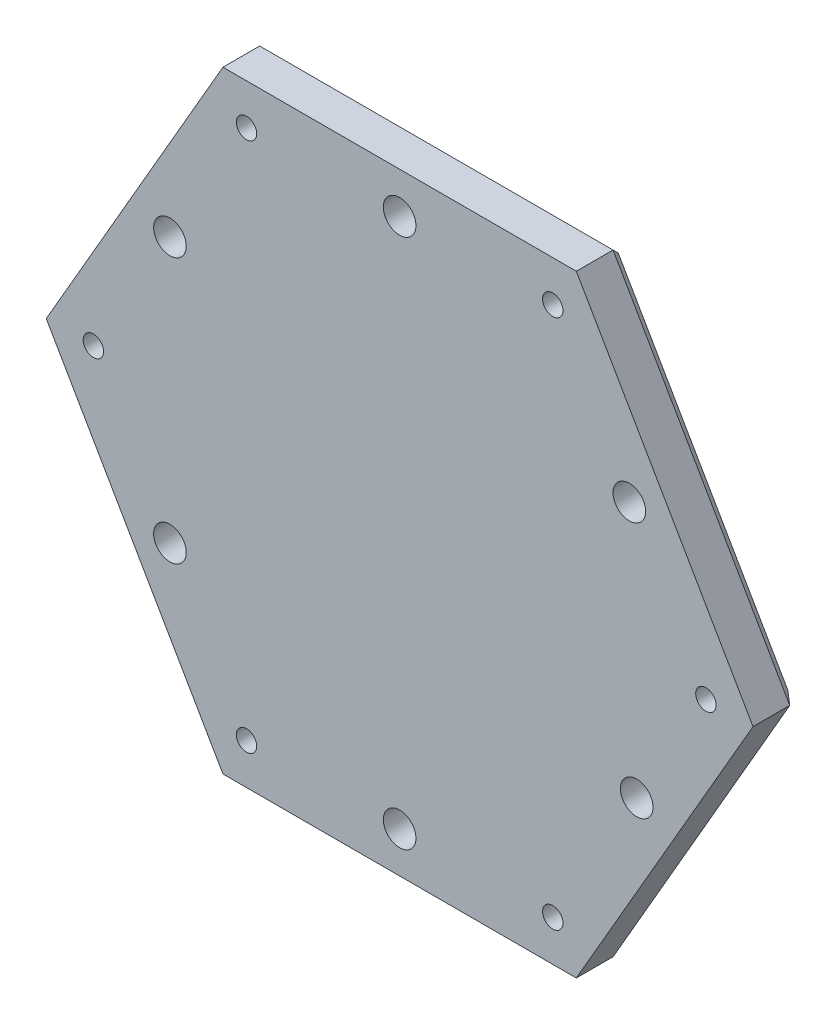
ISO-10303-21;
HEADER;
FILE_DESCRIPTION(('STEP AP214'),'2;1');
FILE_NAME('part.step','',(''),(''),'','','');
FILE_SCHEMA(('AUTOMOTIVE_DESIGN { 1 0 10303 214 1 1 1 1 }'));
ENDSEC;
DATA;
#1=APPLICATION_CONTEXT('core data for automotive mechanical design processes');
#2=APPLICATION_PROTOCOL_DEFINITION('international standard','automotive_design',2000,#1);
#3=PRODUCT_CONTEXT('',#1,'mechanical');
#4=PRODUCT('Part','Part','',(#3));
#5=PRODUCT_RELATED_PRODUCT_CATEGORY('part','',(#4));
#6=PRODUCT_DEFINITION_FORMATION('','',#4);
#7=PRODUCT_DEFINITION_CONTEXT('part definition',#1,'design');
#8=PRODUCT_DEFINITION('design','',#6,#7);
#9=PRODUCT_DEFINITION_SHAPE('','',#8);
#10=(LENGTH_UNIT() NAMED_UNIT(*) SI_UNIT(.MILLI.,.METRE.));
#11=(NAMED_UNIT(*) PLANE_ANGLE_UNIT() SI_UNIT($,.RADIAN.));
#12=(NAMED_UNIT(*) SI_UNIT($,.STERADIAN.) SOLID_ANGLE_UNIT());
#13=UNCERTAINTY_MEASURE_WITH_UNIT(LENGTH_MEASURE(1.E-05),#10,'distance_accuracy_value','');
#14=(GEOMETRIC_REPRESENTATION_CONTEXT(3) GLOBAL_UNCERTAINTY_ASSIGNED_CONTEXT((#13)) GLOBAL_UNIT_ASSIGNED_CONTEXT((#10,
#11,#12)) REPRESENTATION_CONTEXT('',''));
#15=CARTESIAN_POINT('',(0.,0.,0.));
#16=DIRECTION('',(0.,0.,1.));
#17=DIRECTION('',(1.,0.,0.));
#18=AXIS2_PLACEMENT_3D('',#15,#16,#17);
#19=CARTESIAN_POINT('',(43.3012701892223,-75.0000000000007,6.));
#20=DIRECTION('',(-0.866025403784439,0.5,0.));
#21=DIRECTION('',(-0.5,-0.866025403784439,0.));
#22=AXIS2_PLACEMENT_3D('',#19,#20,#21);
#23=PLANE('',#22);
#24=DIRECTION('',(0.,0.,-1.));
#25=VECTOR('',#24,1.);
#26=CARTESIAN_POINT('',(43.3012701892223,-75.0000000000007,6.));
#27=LINE('',#26,#25);
#28=CARTESIAN_POINT('',(43.3012701892223,-75.0000000000007,6.));
#29=VERTEX_POINT('',#28);
#30=CARTESIAN_POINT('',(43.3012701892223,-75.0000000000007,-2.99999999999997));
#31=VERTEX_POINT('',#30);
#32=EDGE_CURVE('E215',#29,#31,#27,.T.);
#33=ORIENTED_EDGE('',*,*,#32,.T.);
#34=DIRECTION('',(0.5,0.866025403784439,0.));
#35=VECTOR('',#34,1.);
#36=CARTESIAN_POINT('',(43.3012701892223,-75.0000000000007,-2.99999999999997));
#37=LINE('',#36,#35);
#38=CARTESIAN_POINT('',(86.6025403784446,0.,-2.99999999999997));
#39=VERTEX_POINT('',#38);
#40=EDGE_CURVE('E11',#31,#39,#37,.T.);
#41=ORIENTED_EDGE('',*,*,#40,.T.);
#42=DIRECTION('',(0.,0.,-1.));
#43=VECTOR('',#42,1.);
#44=CARTESIAN_POINT('',(86.6025403784446,0.,6.));
#45=LINE('',#44,#43);
#46=CARTESIAN_POINT('',(86.6025403784446,0.,6.));
#47=VERTEX_POINT('',#46);
#48=EDGE_CURVE('E125',#47,#39,#45,.T.);
#49=ORIENTED_EDGE('',*,*,#48,.F.);
#50=DIRECTION('',(0.5,0.866025403784438,0.));
#51=VECTOR('',#50,1.);
#52=CARTESIAN_POINT('',(43.3012701892223,-75.0000000000007,6.));
#53=LINE('',#52,#51);
#54=EDGE_CURVE('E132',#29,#47,#53,.T.);
#55=ORIENTED_EDGE('',*,*,#54,.F.);
#56=EDGE_LOOP('',(#33,#41,#49,#55));
#57=FACE_BOUND('',#56,.T.);
#58=ADVANCED_FACE('F45',(#57),#23,.F.);
#59=CARTESIAN_POINT('',(86.6025403784446,0.,6.));
#60=DIRECTION('',(-0.866025403784439,-0.5,0.));
#61=DIRECTION('',(0.5,-0.866025403784439,0.));
#62=AXIS2_PLACEMENT_3D('',#59,#60,#61);
#63=PLANE('',#62);
#64=ORIENTED_EDGE('',*,*,#48,.T.);
#65=DIRECTION('',(-0.5,0.866025403784439,0.));
#66=VECTOR('',#65,1.);
#67=CARTESIAN_POINT('',(86.6025403784446,0.,-2.99999999999997));
#68=LINE('',#67,#66);
#69=CARTESIAN_POINT('',(43.3012701892223,75.0000000000007,-2.99999999999997));
#70=VERTEX_POINT('',#69);
#71=EDGE_CURVE('E141',#39,#70,#68,.T.);
#72=ORIENTED_EDGE('',*,*,#71,.T.);
#73=DIRECTION('',(0.,0.,-1.));
#74=VECTOR('',#73,1.);
#75=CARTESIAN_POINT('',(43.3012701892223,75.0000000000007,6.));
#76=LINE('',#75,#74);
#77=CARTESIAN_POINT('',(43.3012701892223,75.0000000000007,6.));
#78=VERTEX_POINT('',#77);
#79=EDGE_CURVE('E128',#78,#70,#76,.T.);
#80=ORIENTED_EDGE('',*,*,#79,.F.);
#81=DIRECTION('',(-0.5,0.866025403784439,0.));
#82=VECTOR('',#81,1.);
#83=CARTESIAN_POINT('',(86.6025403784446,0.,6.));
#84=LINE('',#83,#82);
#85=EDGE_CURVE('E120',#47,#78,#84,.T.);
#86=ORIENTED_EDGE('',*,*,#85,.F.);
#87=EDGE_LOOP('',(#64,#72,#80,#86));
#88=FACE_BOUND('',#87,.T.);
#89=ADVANCED_FACE('F122',(#88),#63,.F.);
#90=CARTESIAN_POINT('',(43.3012701892223,75.0000000000007,6.));
#91=DIRECTION('',(0.,-1.,0.));
#92=DIRECTION('',(0.,0.,-1.));
#93=AXIS2_PLACEMENT_3D('',#90,#91,#92);
#94=PLANE('',#93);
#95=ORIENTED_EDGE('',*,*,#79,.T.);
#96=DIRECTION('',(-1.,0.,0.));
#97=VECTOR('',#96,1.);
#98=CARTESIAN_POINT('',(43.3012701892223,75.0000000000007,-2.99999999999997));
#99=LINE('',#98,#97);
#100=CARTESIAN_POINT('',(-43.3012701892223,75.0000000000007,-2.99999999999998));
#101=VERTEX_POINT('',#100);
#102=EDGE_CURVE('E161',#70,#101,#99,.T.);
#103=ORIENTED_EDGE('',*,*,#102,.T.);
#104=DIRECTION('',(0.,0.,-1.));
#105=VECTOR('',#104,1.);
#106=CARTESIAN_POINT('',(-43.3012701892223,75.0000000000007,6.));
#107=LINE('',#106,#105);
#108=CARTESIAN_POINT('',(-43.3012701892223,75.0000000000007,6.));
#109=VERTEX_POINT('',#108);
#110=EDGE_CURVE('E145',#109,#101,#107,.T.);
#111=ORIENTED_EDGE('',*,*,#110,.F.);
#112=DIRECTION('',(-1.,0.,0.));
#113=VECTOR('',#112,1.);
#114=CARTESIAN_POINT('',(43.3012701892223,75.0000000000007,6.));
#115=LINE('',#114,#113);
#116=EDGE_CURVE('E131',#78,#109,#115,.T.);
#117=ORIENTED_EDGE('',*,*,#116,.F.);
#118=EDGE_LOOP('',(#95,#103,#111,#117));
#119=FACE_BOUND('',#118,.T.);
#120=ADVANCED_FACE('F204',(#119),#94,.F.);
#121=CARTESIAN_POINT('',(-43.3012701892223,75.0000000000007,6.));
#122=DIRECTION('',(0.866025403784439,-0.5,0.));
#123=DIRECTION('',(0.5,0.866025403784439,0.));
#124=AXIS2_PLACEMENT_3D('',#121,#122,#123);
#125=PLANE('',#124);
#126=ORIENTED_EDGE('',*,*,#110,.T.);
#127=DIRECTION('',(-0.5,-0.866025403784439,0.));
#128=VECTOR('',#127,1.);
#129=CARTESIAN_POINT('',(-43.3012701892223,75.0000000000007,-2.99999999999998));
#130=LINE('',#129,#128);
#131=CARTESIAN_POINT('',(-86.6025403784446,0.,-2.99999999999997));
#132=VERTEX_POINT('',#131);
#133=EDGE_CURVE('E163',#101,#132,#130,.T.);
#134=ORIENTED_EDGE('',*,*,#133,.T.);
#135=DIRECTION('',(0.,0.,-1.));
#136=VECTOR('',#135,1.);
#137=CARTESIAN_POINT('',(-86.6025403784446,0.,6.));
#138=LINE('',#137,#136);
#139=CARTESIAN_POINT('',(-86.6025403784446,0.,6.));
#140=VERTEX_POINT('',#139);
#141=EDGE_CURVE('E219',#140,#132,#138,.T.);
#142=ORIENTED_EDGE('',*,*,#141,.F.);
#143=DIRECTION('',(-0.5,-0.866025403784439,0.));
#144=VECTOR('',#143,1.);
#145=CARTESIAN_POINT('',(-43.3012701892223,75.0000000000007,6.));
#146=LINE('',#145,#144);
#147=EDGE_CURVE('E208',#109,#140,#146,.T.);
#148=ORIENTED_EDGE('',*,*,#147,.F.);
#149=EDGE_LOOP('',(#126,#134,#142,#148));
#150=FACE_BOUND('',#149,.T.);
#151=ADVANCED_FACE('F221',(#150),#125,.F.);
#152=CARTESIAN_POINT('',(-86.6025403784446,0.,6.));
#153=DIRECTION('',(0.866025403784439,0.5,0.));
#154=DIRECTION('',(-0.5,0.866025403784439,0.));
#155=AXIS2_PLACEMENT_3D('',#152,#153,#154);
#156=PLANE('',#155);
#157=ORIENTED_EDGE('',*,*,#141,.T.);
#158=DIRECTION('',(0.5,-0.866025403784439,0.));
#159=VECTOR('',#158,1.);
#160=CARTESIAN_POINT('',(-86.6025403784446,0.,-2.99999999999997));
#161=LINE('',#160,#159);
#162=CARTESIAN_POINT('',(-43.3012701892223,-75.0000000000007,-2.99999999999997));
#163=VERTEX_POINT('',#162);
#164=EDGE_CURVE('E70',#132,#163,#161,.T.);
#165=ORIENTED_EDGE('',*,*,#164,.T.);
#166=DIRECTION('',(0.,0.,-1.));
#167=VECTOR('',#166,1.);
#168=CARTESIAN_POINT('',(-43.3012701892223,-75.0000000000007,6.));
#169=LINE('',#168,#167);
#170=CARTESIAN_POINT('',(-43.3012701892223,-75.0000000000007,6.));
#171=VERTEX_POINT('',#170);
#172=EDGE_CURVE('E217',#171,#163,#169,.T.);
#173=ORIENTED_EDGE('',*,*,#172,.F.);
#174=DIRECTION('',(0.5,-0.866025403784438,0.));
#175=VECTOR('',#174,1.);
#176=CARTESIAN_POINT('',(-86.6025403784446,0.,6.));
#177=LINE('',#176,#175);
#178=EDGE_CURVE('E210',#140,#171,#177,.T.);
#179=ORIENTED_EDGE('',*,*,#178,.F.);
#180=EDGE_LOOP('',(#157,#165,#173,#179));
#181=FACE_BOUND('',#180,.T.);
#182=ADVANCED_FACE('F284',(#181),#156,.F.);
#183=CARTESIAN_POINT('',(-43.3012701892223,-75.0000000000007,6.));
#184=DIRECTION('',(0.,1.,0.));
#185=DIRECTION('',(0.,0.,1.));
#186=AXIS2_PLACEMENT_3D('',#183,#184,#185);
#187=PLANE('',#186);
#188=ORIENTED_EDGE('',*,*,#172,.T.);
#189=DIRECTION('',(1.,0.,0.));
#190=VECTOR('',#189,1.);
#191=CARTESIAN_POINT('',(-43.3012701892223,-75.0000000000007,-2.99999999999997));
#192=LINE('',#191,#190);
#193=EDGE_CURVE('E55',#163,#31,#192,.T.);
#194=ORIENTED_EDGE('',*,*,#193,.T.);
#195=ORIENTED_EDGE('',*,*,#32,.F.);
#196=DIRECTION('',(1.,0.,0.));
#197=VECTOR('',#196,1.);
#198=CARTESIAN_POINT('',(-43.3012701892223,-75.0000000000007,6.));
#199=LINE('',#198,#197);
#200=EDGE_CURVE('E137',#171,#29,#199,.T.);
#201=ORIENTED_EDGE('',*,*,#200,.F.);
#202=EDGE_LOOP('',(#188,#194,#195,#201));
#203=FACE_BOUND('',#202,.T.);
#204=ADVANCED_FACE('F276',(#203),#187,.F.);
#205=CARTESIAN_POINT('',(0.,0.,6.));
#206=DIRECTION('',(0.,0.,1.));
#207=DIRECTION('',(1.,0.,0.));
#208=AXIS2_PLACEMENT_3D('',#205,#206,#207);
#209=PLANE('',#208);
#210=CARTESIAN_POINT('',(-56.2916512459885,32.5,6.));
#211=DIRECTION('',(0.,0.,1.));
#212=DIRECTION('',(1.,0.,0.));
#213=AXIS2_PLACEMENT_3D('',#210,#211,#212);
#214=CIRCLE('',#213,3.99999999999999);
#215=CARTESIAN_POINT('',(-52.2916512459885,32.5,6.));
#216=VERTEX_POINT('',#215);
#217=EDGE_CURVE('E490',#216,#216,#214,.T.);
#218=ORIENTED_EDGE('',*,*,#217,.F.);
#219=EDGE_LOOP('',(#218));
#220=FACE_BOUND('',#219,.T.);
#221=CARTESIAN_POINT('',(0.,65.,6.));
#222=DIRECTION('',(0.,0.,1.));
#223=DIRECTION('',(1.,0.,0.));
#224=AXIS2_PLACEMENT_3D('',#221,#222,#223);
#225=CIRCLE('',#224,3.99999999999999);
#226=CARTESIAN_POINT('',(3.99999999999995,65.,6.));
#227=VERTEX_POINT('',#226);
#228=EDGE_CURVE('E492',#227,#227,#225,.T.);
#229=ORIENTED_EDGE('',*,*,#228,.F.);
#230=EDGE_LOOP('',(#229));
#231=FACE_BOUND('',#230,.T.);
#232=CARTESIAN_POINT('',(56.2916512459885,32.5,6.));
#233=DIRECTION('',(0.,0.,1.));
#234=DIRECTION('',(1.,0.,0.));
#235=AXIS2_PLACEMENT_3D('',#232,#233,#234);
#236=CIRCLE('',#235,3.99999999999999);
#237=CARTESIAN_POINT('',(60.2916512459885,32.5,6.));
#238=VERTEX_POINT('',#237);
#239=EDGE_CURVE('E500',#238,#238,#236,.T.);
#240=ORIENTED_EDGE('',*,*,#239,.F.);
#241=EDGE_LOOP('',(#240));
#242=FACE_BOUND('',#241,.T.);
#243=CARTESIAN_POINT('',(58.0963351892695,-29.3741957186336,6.));
#244=DIRECTION('',(0.,0.,1.));
#245=DIRECTION('',(1.,0.,0.));
#246=AXIS2_PLACEMENT_3D('',#243,#244,#245);
#247=CIRCLE('',#246,3.99999999999999);
#248=CARTESIAN_POINT('',(62.0963351892694,-29.3741957186336,6.));
#249=VERTEX_POINT('',#248);
#250=EDGE_CURVE('E506',#249,#249,#247,.T.);
#251=ORIENTED_EDGE('',*,*,#250,.F.);
#252=EDGE_LOOP('',(#251));
#253=FACE_BOUND('',#252,.T.);
#254=CARTESIAN_POINT('',(0.,-65.,6.));
#255=DIRECTION('',(0.,0.,1.));
#256=DIRECTION('',(1.,0.,0.));
#257=AXIS2_PLACEMENT_3D('',#254,#255,#256);
#258=CIRCLE('',#257,3.99999999999999);
#259=CARTESIAN_POINT('',(3.99999999999997,-65.,6.));
#260=VERTEX_POINT('',#259);
#261=EDGE_CURVE('E512',#260,#260,#258,.T.);
#262=ORIENTED_EDGE('',*,*,#261,.F.);
#263=EDGE_LOOP('',(#262));
#264=FACE_BOUND('',#263,.T.);
#265=CARTESIAN_POINT('',(-56.2916512459885,-32.5,6.));
#266=DIRECTION('',(0.,0.,1.));
#267=DIRECTION('',(1.,0.,0.));
#268=AXIS2_PLACEMENT_3D('',#265,#266,#267);
#269=CIRCLE('',#268,3.99999999999999);
#270=CARTESIAN_POINT('',(-52.2916512459885,-32.5,6.));
#271=VERTEX_POINT('',#270);
#272=EDGE_CURVE('E518',#271,#271,#269,.T.);
#273=ORIENTED_EDGE('',*,*,#272,.F.);
#274=EDGE_LOOP('',(#273));
#275=FACE_BOUND('',#274,.T.);
#276=CARTESIAN_POINT('',(-37.5277674973257,65.,6.));
#277=DIRECTION('',(0.,0.,1.));
#278=DIRECTION('',(1.,0.,0.));
#279=AXIS2_PLACEMENT_3D('',#276,#277,#278);
#280=CIRCLE('',#279,2.5);
#281=CARTESIAN_POINT('',(-35.0277674973257,65.,6.));
#282=VERTEX_POINT('',#281);
#283=EDGE_CURVE('E524',#282,#282,#280,.T.);
#284=ORIENTED_EDGE('',*,*,#283,.F.);
#285=EDGE_LOOP('',(#284));
#286=FACE_BOUND('',#285,.T.);
#287=CARTESIAN_POINT('',(37.5277674973256,65.,6.));
#288=DIRECTION('',(0.,0.,1.));
#289=DIRECTION('',(1.,0.,0.));
#290=AXIS2_PLACEMENT_3D('',#287,#288,#289);
#291=CIRCLE('',#290,2.5);
#292=CARTESIAN_POINT('',(40.0277674973256,65.,6.));
#293=VERTEX_POINT('',#292);
#294=EDGE_CURVE('E530',#293,#293,#291,.T.);
#295=ORIENTED_EDGE('',*,*,#294,.F.);
#296=EDGE_LOOP('',(#295));
#297=FACE_BOUND('',#296,.T.);
#298=CARTESIAN_POINT('',(75.0555349946513,0.,6.));
#299=DIRECTION('',(0.,0.,1.));
#300=DIRECTION('',(1.,0.,0.));
#301=AXIS2_PLACEMENT_3D('',#298,#299,#300);
#302=CIRCLE('',#301,2.49999999999999);
#303=CARTESIAN_POINT('',(77.5555349946513,0.,6.));
#304=VERTEX_POINT('',#303);
#305=EDGE_CURVE('E536',#304,#304,#302,.T.);
#306=ORIENTED_EDGE('',*,*,#305,.F.);
#307=EDGE_LOOP('',(#306));
#308=FACE_BOUND('',#307,.T.);
#309=CARTESIAN_POINT('',(37.5277674973257,-65.,6.));
#310=DIRECTION('',(0.,0.,1.));
#311=DIRECTION('',(1.,0.,0.));
#312=AXIS2_PLACEMENT_3D('',#309,#310,#311);
#313=CIRCLE('',#312,2.5);
#314=CARTESIAN_POINT('',(40.0277674973257,-65.,6.));
#315=VERTEX_POINT('',#314);
#316=EDGE_CURVE('E542',#315,#315,#313,.T.);
#317=ORIENTED_EDGE('',*,*,#316,.F.);
#318=EDGE_LOOP('',(#317));
#319=FACE_BOUND('',#318,.T.);
#320=CARTESIAN_POINT('',(-37.5277674973257,-65.,6.));
#321=DIRECTION('',(0.,0.,1.));
#322=DIRECTION('',(1.,0.,0.));
#323=AXIS2_PLACEMENT_3D('',#320,#321,#322);
#324=CIRCLE('',#323,2.5);
#325=CARTESIAN_POINT('',(-35.0277674973257,-65.,6.));
#326=VERTEX_POINT('',#325);
#327=EDGE_CURVE('E548',#326,#326,#324,.T.);
#328=ORIENTED_EDGE('',*,*,#327,.F.);
#329=EDGE_LOOP('',(#328));
#330=FACE_BOUND('',#329,.T.);
#331=CARTESIAN_POINT('',(-75.0555349946514,0.,6.));
#332=DIRECTION('',(0.,0.,1.));
#333=DIRECTION('',(1.,0.,0.));
#334=AXIS2_PLACEMENT_3D('',#331,#332,#333);
#335=CIRCLE('',#334,2.49999999999999);
#336=CARTESIAN_POINT('',(-72.5555349946514,0.,6.));
#337=VERTEX_POINT('',#336);
#338=EDGE_CURVE('E554',#337,#337,#335,.T.);
#339=ORIENTED_EDGE('',*,*,#338,.F.);
#340=EDGE_LOOP('',(#339));
#341=FACE_BOUND('',#340,.T.);
#342=ORIENTED_EDGE('',*,*,#54,.T.);
#343=ORIENTED_EDGE('',*,*,#85,.T.);
#344=ORIENTED_EDGE('',*,*,#116,.T.);
#345=ORIENTED_EDGE('',*,*,#147,.T.);
#346=ORIENTED_EDGE('',*,*,#178,.T.);
#347=ORIENTED_EDGE('',*,*,#200,.T.);
#348=EDGE_LOOP('',(#342,#343,#344,#345,#346,#347));
#349=FACE_BOUND('',#348,.T.);
#350=ADVANCED_FACE('F135',(#220,#231,#242,#253,#264,#275,#286,#297,#308,#319,#330,#341,#349),
#209,.T.);
#351=CARTESIAN_POINT('',(0.,0.,-6.));
#352=DIRECTION('',(0.,0.,1.));
#353=DIRECTION('',(1.,0.,0.));
#354=AXIS2_PLACEMENT_3D('',#351,#352,#353);
#355=PLANE('',#354);
#356=CARTESIAN_POINT('',(-56.2916512459885,32.5,-6.));
#357=DIRECTION('',(0.,0.,1.));
#358=DIRECTION('',(1.,0.,0.));
#359=AXIS2_PLACEMENT_3D('',#356,#357,#358);
#360=CIRCLE('',#359,3.99999999999999);
#361=CARTESIAN_POINT('',(-52.2916512459885,32.5,-6.));
#362=VERTEX_POINT('',#361);
#363=EDGE_CURVE('E487',#362,#362,#360,.T.);
#364=ORIENTED_EDGE('',*,*,#363,.T.);
#365=EDGE_LOOP('',(#364));
#366=FACE_BOUND('',#365,.T.);
#367=CARTESIAN_POINT('',(0.,65.,-6.));
#368=DIRECTION('',(0.,0.,1.));
#369=DIRECTION('',(1.,0.,0.));
#370=AXIS2_PLACEMENT_3D('',#367,#368,#369);
#371=CIRCLE('',#370,3.99999999999999);
#372=CARTESIAN_POINT('',(3.99999999999996,65.,-6.));
#373=VERTEX_POINT('',#372);
#374=EDGE_CURVE('E497',#373,#373,#371,.T.);
#375=ORIENTED_EDGE('',*,*,#374,.T.);
#376=EDGE_LOOP('',(#375));
#377=FACE_BOUND('',#376,.T.);
#378=CARTESIAN_POINT('',(56.2916512459885,32.5,-6.));
#379=DIRECTION('',(0.,0.,1.));
#380=DIRECTION('',(1.,0.,0.));
#381=AXIS2_PLACEMENT_3D('',#378,#379,#380);
#382=CIRCLE('',#381,3.99999999999999);
#383=CARTESIAN_POINT('',(60.2916512459885,32.5,-6.));
#384=VERTEX_POINT('',#383);
#385=EDGE_CURVE('E503',#384,#384,#382,.T.);
#386=ORIENTED_EDGE('',*,*,#385,.T.);
#387=EDGE_LOOP('',(#386));
#388=FACE_BOUND('',#387,.T.);
#389=CARTESIAN_POINT('',(58.0963351892695,-29.3741957186336,-6.));
#390=DIRECTION('',(0.,0.,1.));
#391=DIRECTION('',(1.,0.,0.));
#392=AXIS2_PLACEMENT_3D('',#389,#390,#391);
#393=CIRCLE('',#392,3.99999999999999);
#394=CARTESIAN_POINT('',(62.0963351892694,-29.3741957186336,-6.));
#395=VERTEX_POINT('',#394);
#396=EDGE_CURVE('E509',#395,#395,#393,.T.);
#397=ORIENTED_EDGE('',*,*,#396,.T.);
#398=EDGE_LOOP('',(#397));
#399=FACE_BOUND('',#398,.T.);
#400=CARTESIAN_POINT('',(0.,-65.,-6.));
#401=DIRECTION('',(0.,0.,1.));
#402=DIRECTION('',(1.,0.,0.));
#403=AXIS2_PLACEMENT_3D('',#400,#401,#402);
#404=CIRCLE('',#403,3.99999999999999);
#405=CARTESIAN_POINT('',(3.99999999999997,-65.,-6.));
#406=VERTEX_POINT('',#405);
#407=EDGE_CURVE('E515',#406,#406,#404,.T.);
#408=ORIENTED_EDGE('',*,*,#407,.T.);
#409=EDGE_LOOP('',(#408));
#410=FACE_BOUND('',#409,.T.);
#411=CARTESIAN_POINT('',(-56.2916512459885,-32.5,-6.));
#412=DIRECTION('',(0.,0.,1.));
#413=DIRECTION('',(1.,0.,0.));
#414=AXIS2_PLACEMENT_3D('',#411,#412,#413);
#415=CIRCLE('',#414,3.99999999999999);
#416=CARTESIAN_POINT('',(-52.2916512459885,-32.5,-6.));
#417=VERTEX_POINT('',#416);
#418=EDGE_CURVE('E521',#417,#417,#415,.T.);
#419=ORIENTED_EDGE('',*,*,#418,.T.);
#420=EDGE_LOOP('',(#419));
#421=FACE_BOUND('',#420,.T.);
#422=CARTESIAN_POINT('',(-37.5277674973257,65.,-6.));
#423=DIRECTION('',(0.,0.,1.));
#424=DIRECTION('',(1.,0.,0.));
#425=AXIS2_PLACEMENT_3D('',#422,#423,#424);
#426=CIRCLE('',#425,2.49999999999999);
#427=CARTESIAN_POINT('',(-35.0277674973257,65.,-6.));
#428=VERTEX_POINT('',#427);
#429=EDGE_CURVE('E527',#428,#428,#426,.T.);
#430=ORIENTED_EDGE('',*,*,#429,.T.);
#431=EDGE_LOOP('',(#430));
#432=FACE_BOUND('',#431,.T.);
#433=CARTESIAN_POINT('',(37.5277674973256,65.,-6.));
#434=DIRECTION('',(0.,0.,1.));
#435=DIRECTION('',(1.,0.,0.));
#436=AXIS2_PLACEMENT_3D('',#433,#434,#435);
#437=CIRCLE('',#436,2.49999999999999);
#438=CARTESIAN_POINT('',(40.0277674973256,65.,-6.));
#439=VERTEX_POINT('',#438);
#440=EDGE_CURVE('E533',#439,#439,#437,.T.);
#441=ORIENTED_EDGE('',*,*,#440,.T.);
#442=EDGE_LOOP('',(#441));
#443=FACE_BOUND('',#442,.T.);
#444=CARTESIAN_POINT('',(75.0555349946513,0.,-6.));
#445=DIRECTION('',(0.,0.,1.));
#446=DIRECTION('',(1.,0.,0.));
#447=AXIS2_PLACEMENT_3D('',#444,#445,#446);
#448=CIRCLE('',#447,2.49999999999999);
#449=CARTESIAN_POINT('',(77.5555349946513,0.,-6.));
#450=VERTEX_POINT('',#449);
#451=EDGE_CURVE('E539',#450,#450,#448,.T.);
#452=ORIENTED_EDGE('',*,*,#451,.T.);
#453=EDGE_LOOP('',(#452));
#454=FACE_BOUND('',#453,.T.);
#455=CARTESIAN_POINT('',(37.5277674973257,-65.,-6.));
#456=DIRECTION('',(0.,0.,1.));
#457=DIRECTION('',(1.,0.,0.));
#458=AXIS2_PLACEMENT_3D('',#455,#456,#457);
#459=CIRCLE('',#458,2.49999999999999);
#460=CARTESIAN_POINT('',(40.0277674973256,-65.,-6.));
#461=VERTEX_POINT('',#460);
#462=EDGE_CURVE('E545',#461,#461,#459,.T.);
#463=ORIENTED_EDGE('',*,*,#462,.T.);
#464=EDGE_LOOP('',(#463));
#465=FACE_BOUND('',#464,.T.);
#466=CARTESIAN_POINT('',(-37.5277674973257,-65.,-6.));
#467=DIRECTION('',(0.,0.,1.));
#468=DIRECTION('',(1.,0.,0.));
#469=AXIS2_PLACEMENT_3D('',#466,#467,#468);
#470=CIRCLE('',#469,2.49999999999999);
#471=CARTESIAN_POINT('',(-35.0277674973257,-65.,-6.));
#472=VERTEX_POINT('',#471);
#473=EDGE_CURVE('E551',#472,#472,#470,.T.);
#474=ORIENTED_EDGE('',*,*,#473,.T.);
#475=EDGE_LOOP('',(#474));
#476=FACE_BOUND('',#475,.T.);
#477=CARTESIAN_POINT('',(-75.0555349946514,0.,-6.));
#478=DIRECTION('',(0.,0.,1.));
#479=DIRECTION('',(1.,0.,0.));
#480=AXIS2_PLACEMENT_3D('',#477,#478,#479);
#481=CIRCLE('',#480,2.49999999999999);
#482=CARTESIAN_POINT('',(-72.5555349946514,0.,-6.));
#483=VERTEX_POINT('',#482);
#484=EDGE_CURVE('E170',#483,#483,#481,.T.);
#485=ORIENTED_EDGE('',*,*,#484,.T.);
#486=EDGE_LOOP('',(#485));
#487=FACE_BOUND('',#486,.T.);
#488=DIRECTION('',(1.,0.,0.));
#489=VECTOR('',#488,1.);
#490=CARTESIAN_POINT('',(0.,72.0000000000006,-6.));
#491=LINE('',#490,#489);
#492=CARTESIAN_POINT('',(-41.5692193816534,72.0000000000006,-6.));
#493=VERTEX_POINT('',#492);
#494=CARTESIAN_POINT('',(41.5692193816534,72.0000000000006,-6.));
#495=VERTEX_POINT('',#494);
#496=EDGE_CURVE('E156',#493,#495,#491,.T.);
#497=ORIENTED_EDGE('',*,*,#496,.T.);
#498=DIRECTION('',(0.5,-0.866025403784439,0.));
#499=VECTOR('',#498,1.);
#500=CARTESIAN_POINT('',(62.3538290724801,36.0000000000003,-6.));
#501=LINE('',#500,#499);
#502=CARTESIAN_POINT('',(83.1384387633068,0.,-6.));
#503=VERTEX_POINT('',#502);
#504=EDGE_CURVE('E158',#495,#503,#501,.T.);
#505=ORIENTED_EDGE('',*,*,#504,.T.);
#506=DIRECTION('',(-0.5,-0.866025403784439,0.));
#507=VECTOR('',#506,1.);
#508=CARTESIAN_POINT('',(62.3538290724801,-36.0000000000003,-6.));
#509=LINE('',#508,#507);
#510=CARTESIAN_POINT('',(41.5692193816534,-72.0000000000006,-6.));
#511=VERTEX_POINT('',#510);
#512=EDGE_CURVE('E143',#503,#511,#509,.T.);
#513=ORIENTED_EDGE('',*,*,#512,.T.);
#514=DIRECTION('',(-1.,0.,0.));
#515=VECTOR('',#514,1.);
#516=CARTESIAN_POINT('',(0.,-72.0000000000006,-6.));
#517=LINE('',#516,#515);
#518=CARTESIAN_POINT('',(-41.5692193816534,-72.0000000000006,-6.));
#519=VERTEX_POINT('',#518);
#520=EDGE_CURVE('E150',#511,#519,#517,.T.);
#521=ORIENTED_EDGE('',*,*,#520,.T.);
#522=DIRECTION('',(-0.5,0.866025403784439,0.));
#523=VECTOR('',#522,1.);
#524=CARTESIAN_POINT('',(-62.3538290724801,-36.0000000000003,-6.));
#525=LINE('',#524,#523);
#526=CARTESIAN_POINT('',(-83.1384387633068,0.,-6.));
#527=VERTEX_POINT('',#526);
#528=EDGE_CURVE('E152',#519,#527,#525,.T.);
#529=ORIENTED_EDGE('',*,*,#528,.T.);
#530=DIRECTION('',(0.5,0.866025403784439,0.));
#531=VECTOR('',#530,1.);
#532=CARTESIAN_POINT('',(-62.3538290724801,36.0000000000003,-6.));
#533=LINE('',#532,#531);
#534=EDGE_CURVE('E154',#527,#493,#533,.T.);
#535=ORIENTED_EDGE('',*,*,#534,.T.);
#536=EDGE_LOOP('',(#497,#505,#513,#521,#529,#535));
#537=FACE_BOUND('',#536,.T.);
#538=ADVANCED_FACE('F192',(#366,#377,#388,#399,#410,#421,#432,#443,#454,#465,#476,#487,#537),
#355,.F.);
#539=CARTESIAN_POINT('',(-86.6025403784446,0.,-2.99999999999997));
#540=DIRECTION('',(0.612372435695793,0.353553390593273,0.707106781186549));
#541=DIRECTION('',(0.5,-0.866025403784439,0.));
#542=AXIS2_PLACEMENT_3D('',#539,#540,#541);
#543=PLANE('',#542);
#544=DIRECTION('',(0.755928946018456,0.,-0.654653670707975));
#545=VECTOR('',#544,1.);
#546=CARTESIAN_POINT('',(-86.6025403784446,0.,-2.99999999999997));
#547=LINE('',#546,#545);
#548=EDGE_CURVE('E177',#527,#132,#547,.F.);
#549=ORIENTED_EDGE('',*,*,#548,.F.);
#550=ORIENTED_EDGE('',*,*,#528,.F.);
#551=DIRECTION('',(0.377964473009227,0.654653670707979,-0.654653670707976));
#552=VECTOR('',#551,1.);
#553=CARTESIAN_POINT('',(-43.3012701892223,-75.0000000000007,-2.99999999999997));
#554=LINE('',#553,#552);
#555=EDGE_CURVE('E50',#163,#519,#554,.T.);
#556=ORIENTED_EDGE('',*,*,#555,.F.);
#557=ORIENTED_EDGE('',*,*,#164,.F.);
#558=EDGE_LOOP('',(#549,#550,#556,#557));
#559=FACE_BOUND('',#558,.T.);
#560=ADVANCED_FACE('F48',(#559),#543,.F.);
#561=CARTESIAN_POINT('',(-43.3012701892223,-75.0000000000007,-2.99999999999997));
#562=DIRECTION('',(0.,0.707106781186546,0.707106781186549));
#563=DIRECTION('',(1.,0.,0.));
#564=AXIS2_PLACEMENT_3D('',#561,#562,#563);
#565=PLANE('',#564);
#566=ORIENTED_EDGE('',*,*,#555,.T.);
#567=ORIENTED_EDGE('',*,*,#520,.F.);
#568=DIRECTION('',(-0.377964473009231,0.654653670707978,-0.654653670707975));
#569=VECTOR('',#568,1.);
#570=CARTESIAN_POINT('',(43.3012701892223,-75.0000000000007,-2.99999999999997));
#571=LINE('',#570,#569);
#572=EDGE_CURVE('E175',#31,#511,#571,.T.);
#573=ORIENTED_EDGE('',*,*,#572,.F.);
#574=ORIENTED_EDGE('',*,*,#193,.F.);
#575=EDGE_LOOP('',(#566,#567,#573,#574));
#576=FACE_BOUND('',#575,.T.);
#577=ADVANCED_FACE('F187',(#576),#565,.F.);
#578=CARTESIAN_POINT('',(-43.3012701892223,75.0000000000007,-2.99999999999997));
#579=DIRECTION('',(0.612372435695792,-0.353553390593273,0.70710678118655));
#580=DIRECTION('',(-0.5,-0.866025403784439,0.));
#581=AXIS2_PLACEMENT_3D('',#578,#579,#580);
#582=PLANE('',#581);
#583=ORIENTED_EDGE('',*,*,#548,.T.);
#584=ORIENTED_EDGE('',*,*,#133,.F.);
#585=DIRECTION('',(0.377964473009229,-0.654653670707978,-0.654653670707975));
#586=VECTOR('',#585,1.);
#587=CARTESIAN_POINT('',(-43.3012701892223,75.0000000000007,-2.99999999999997));
#588=LINE('',#587,#586);
#589=EDGE_CURVE('E172',#493,#101,#588,.F.);
#590=ORIENTED_EDGE('',*,*,#589,.F.);
#591=ORIENTED_EDGE('',*,*,#534,.F.);
#592=EDGE_LOOP('',(#583,#584,#590,#591));
#593=FACE_BOUND('',#592,.T.);
#594=ADVANCED_FACE('F223',(#593),#582,.F.);
#595=CARTESIAN_POINT('',(43.3012701892223,-75.0000000000007,-2.99999999999997));
#596=DIRECTION('',(-0.612372435695792,0.353553390593272,0.707106781186551));
#597=DIRECTION('',(0.5,0.866025403784439,0.));
#598=AXIS2_PLACEMENT_3D('',#595,#596,#597);
#599=PLANE('',#598);
#600=ORIENTED_EDGE('',*,*,#572,.T.);
#601=ORIENTED_EDGE('',*,*,#512,.F.);
#602=DIRECTION('',(0.755928946018457,0.,0.654653670707974));
#603=VECTOR('',#602,1.);
#604=CARTESIAN_POINT('',(61.8589574131746,0.,-24.4285714285715));
#605=LINE('',#604,#603);
#606=EDGE_CURVE('E169',#39,#503,#605,.F.);
#607=ORIENTED_EDGE('',*,*,#606,.F.);
#608=ORIENTED_EDGE('',*,*,#40,.F.);
#609=EDGE_LOOP('',(#600,#601,#607,#608));
#610=FACE_BOUND('',#609,.T.);
#611=ADVANCED_FACE('F197',(#610),#599,.F.);
#612=CARTESIAN_POINT('',(43.3012701892223,75.0000000000007,-2.99999999999997));
#613=DIRECTION('',(0.,-0.707106781186546,0.707106781186549));
#614=DIRECTION('',(-1.,0.,0.));
#615=AXIS2_PLACEMENT_3D('',#612,#613,#614);
#616=PLANE('',#615);
#617=ORIENTED_EDGE('',*,*,#589,.T.);
#618=ORIENTED_EDGE('',*,*,#102,.F.);
#619=DIRECTION('',(-0.377964473009229,-0.654653670707978,-0.654653670707975));
#620=VECTOR('',#619,1.);
#621=CARTESIAN_POINT('',(43.3012701892223,75.0000000000007,-2.99999999999997));
#622=LINE('',#621,#620);
#623=EDGE_CURVE('E167',#495,#70,#622,.F.);
#624=ORIENTED_EDGE('',*,*,#623,.F.);
#625=ORIENTED_EDGE('',*,*,#496,.F.);
#626=EDGE_LOOP('',(#617,#618,#624,#625));
#627=FACE_BOUND('',#626,.T.);
#628=ADVANCED_FACE('F226',(#627),#616,.F.);
#629=CARTESIAN_POINT('',(86.6025403784446,0.,-2.99999999999997));
#630=DIRECTION('',(-0.612372435695792,-0.353553390593273,0.70710678118655));
#631=DIRECTION('',(-0.5,0.866025403784439,0.));
#632=AXIS2_PLACEMENT_3D('',#629,#630,#631);
#633=PLANE('',#632);
#634=ORIENTED_EDGE('',*,*,#606,.T.);
#635=ORIENTED_EDGE('',*,*,#504,.F.);
#636=ORIENTED_EDGE('',*,*,#623,.T.);
#637=ORIENTED_EDGE('',*,*,#71,.F.);
#638=EDGE_LOOP('',(#634,#635,#636,#637));
#639=FACE_BOUND('',#638,.T.);
#640=ADVANCED_FACE('F200',(#639),#633,.F.);
#641=CARTESIAN_POINT('',(-75.0555349946514,0.,6.));
#642=DIRECTION('',(0.,0.,1.));
#643=DIRECTION('',(1.,0.,0.));
#644=AXIS2_PLACEMENT_3D('',#641,#642,#643);
#645=CYLINDRICAL_SURFACE('',#644,2.49999999999999);
#646=ORIENTED_EDGE('',*,*,#484,.F.);
#647=EDGE_LOOP('',(#646));
#648=FACE_BOUND('',#647,.T.);
#649=ORIENTED_EDGE('',*,*,#338,.T.);
#650=EDGE_LOOP('',(#649));
#651=FACE_BOUND('',#650,.T.);
#652=ADVANCED_FACE('F233',(#648,#651),#645,.F.);
#653=CARTESIAN_POINT('',(-37.5277674973257,-65.,6.));
#654=DIRECTION('',(0.,0.,1.));
#655=DIRECTION('',(1.,0.,0.));
#656=AXIS2_PLACEMENT_3D('',#653,#654,#655);
#657=CYLINDRICAL_SURFACE('',#656,2.49999999999999);
#658=ORIENTED_EDGE('',*,*,#473,.F.);
#659=EDGE_LOOP('',(#658));
#660=FACE_BOUND('',#659,.T.);
#661=ORIENTED_EDGE('',*,*,#327,.T.);
#662=EDGE_LOOP('',(#661));
#663=FACE_BOUND('',#662,.T.);
#664=ADVANCED_FACE('F363',(#660,#663),#657,.F.);
#665=CARTESIAN_POINT('',(37.5277674973257,-65.,6.));
#666=DIRECTION('',(0.,0.,1.));
#667=DIRECTION('',(1.,0.,0.));
#668=AXIS2_PLACEMENT_3D('',#665,#666,#667);
#669=CYLINDRICAL_SURFACE('',#668,2.49999999999999);
#670=ORIENTED_EDGE('',*,*,#462,.F.);
#671=EDGE_LOOP('',(#670));
#672=FACE_BOUND('',#671,.T.);
#673=ORIENTED_EDGE('',*,*,#316,.T.);
#674=EDGE_LOOP('',(#673));
#675=FACE_BOUND('',#674,.T.);
#676=ADVANCED_FACE('F374',(#672,#675),#669,.F.);
#677=CARTESIAN_POINT('',(75.0555349946513,0.,6.));
#678=DIRECTION('',(0.,0.,1.));
#679=DIRECTION('',(1.,0.,0.));
#680=AXIS2_PLACEMENT_3D('',#677,#678,#679);
#681=CYLINDRICAL_SURFACE('',#680,2.49999999999999);
#682=ORIENTED_EDGE('',*,*,#451,.F.);
#683=EDGE_LOOP('',(#682));
#684=FACE_BOUND('',#683,.T.);
#685=ORIENTED_EDGE('',*,*,#305,.T.);
#686=EDGE_LOOP('',(#685));
#687=FACE_BOUND('',#686,.T.);
#688=ADVANCED_FACE('F386',(#684,#687),#681,.F.);
#689=CARTESIAN_POINT('',(37.5277674973256,65.,6.));
#690=DIRECTION('',(0.,0.,1.));
#691=DIRECTION('',(1.,0.,0.));
#692=AXIS2_PLACEMENT_3D('',#689,#690,#691);
#693=CYLINDRICAL_SURFACE('',#692,2.49999999999999);
#694=ORIENTED_EDGE('',*,*,#440,.F.);
#695=EDGE_LOOP('',(#694));
#696=FACE_BOUND('',#695,.T.);
#697=ORIENTED_EDGE('',*,*,#294,.T.);
#698=EDGE_LOOP('',(#697));
#699=FACE_BOUND('',#698,.T.);
#700=ADVANCED_FACE('F398',(#696,#699),#693,.F.);
#701=CARTESIAN_POINT('',(-37.5277674973257,65.,6.));
#702=DIRECTION('',(0.,0.,1.));
#703=DIRECTION('',(1.,0.,0.));
#704=AXIS2_PLACEMENT_3D('',#701,#702,#703);
#705=CYLINDRICAL_SURFACE('',#704,2.49999999999999);
#706=ORIENTED_EDGE('',*,*,#429,.F.);
#707=EDGE_LOOP('',(#706));
#708=FACE_BOUND('',#707,.T.);
#709=ORIENTED_EDGE('',*,*,#283,.T.);
#710=EDGE_LOOP('',(#709));
#711=FACE_BOUND('',#710,.T.);
#712=ADVANCED_FACE('F410',(#708,#711),#705,.F.);
#713=CARTESIAN_POINT('',(-56.2916512459885,-32.5,6.));
#714=DIRECTION('',(0.,0.,1.));
#715=DIRECTION('',(1.,0.,0.));
#716=AXIS2_PLACEMENT_3D('',#713,#714,#715);
#717=CYLINDRICAL_SURFACE('',#716,3.99999999999999);
#718=ORIENTED_EDGE('',*,*,#418,.F.);
#719=EDGE_LOOP('',(#718));
#720=FACE_BOUND('',#719,.T.);
#721=ORIENTED_EDGE('',*,*,#272,.T.);
#722=EDGE_LOOP('',(#721));
#723=FACE_BOUND('',#722,.T.);
#724=ADVANCED_FACE('F422',(#720,#723),#717,.F.);
#725=CARTESIAN_POINT('',(0.,-65.,6.));
#726=DIRECTION('',(0.,0.,1.));
#727=DIRECTION('',(1.,0.,0.));
#728=AXIS2_PLACEMENT_3D('',#725,#726,#727);
#729=CYLINDRICAL_SURFACE('',#728,3.99999999999999);
#730=ORIENTED_EDGE('',*,*,#407,.F.);
#731=EDGE_LOOP('',(#730));
#732=FACE_BOUND('',#731,.T.);
#733=ORIENTED_EDGE('',*,*,#261,.T.);
#734=EDGE_LOOP('',(#733));
#735=FACE_BOUND('',#734,.T.);
#736=ADVANCED_FACE('F432',(#732,#735),#729,.F.);
#737=CARTESIAN_POINT('',(58.0963351892695,-29.3741957186336,6.));
#738=DIRECTION('',(0.,0.,1.));
#739=DIRECTION('',(1.,0.,0.));
#740=AXIS2_PLACEMENT_3D('',#737,#738,#739);
#741=CYLINDRICAL_SURFACE('',#740,3.99999999999999);
#742=ORIENTED_EDGE('',*,*,#396,.F.);
#743=EDGE_LOOP('',(#742));
#744=FACE_BOUND('',#743,.T.);
#745=ORIENTED_EDGE('',*,*,#250,.T.);
#746=EDGE_LOOP('',(#745));
#747=FACE_BOUND('',#746,.T.);
#748=ADVANCED_FACE('F442',(#744,#747),#741,.F.);
#749=CARTESIAN_POINT('',(56.2916512459885,32.5,6.));
#750=DIRECTION('',(0.,0.,1.));
#751=DIRECTION('',(1.,0.,0.));
#752=AXIS2_PLACEMENT_3D('',#749,#750,#751);
#753=CYLINDRICAL_SURFACE('',#752,3.99999999999999);
#754=ORIENTED_EDGE('',*,*,#385,.F.);
#755=EDGE_LOOP('',(#754));
#756=FACE_BOUND('',#755,.T.);
#757=ORIENTED_EDGE('',*,*,#239,.T.);
#758=EDGE_LOOP('',(#757));
#759=FACE_BOUND('',#758,.T.);
#760=ADVANCED_FACE('F452',(#756,#759),#753,.F.);
#761=CARTESIAN_POINT('',(0.,65.,6.));
#762=DIRECTION('',(0.,0.,1.));
#763=DIRECTION('',(1.,0.,0.));
#764=AXIS2_PLACEMENT_3D('',#761,#762,#763);
#765=CYLINDRICAL_SURFACE('',#764,3.99999999999999);
#766=ORIENTED_EDGE('',*,*,#374,.F.);
#767=EDGE_LOOP('',(#766));
#768=FACE_BOUND('',#767,.T.);
#769=ORIENTED_EDGE('',*,*,#228,.T.);
#770=EDGE_LOOP('',(#769));
#771=FACE_BOUND('',#770,.T.);
#772=ADVANCED_FACE('F462',(#768,#771),#765,.F.);
#773=CARTESIAN_POINT('',(-56.2916512459885,32.5,6.));
#774=DIRECTION('',(0.,0.,1.));
#775=DIRECTION('',(1.,0.,0.));
#776=AXIS2_PLACEMENT_3D('',#773,#774,#775);
#777=CYLINDRICAL_SURFACE('',#776,3.99999999999999);
#778=ORIENTED_EDGE('',*,*,#363,.F.);
#779=EDGE_LOOP('',(#778));
#780=FACE_BOUND('',#779,.T.);
#781=ORIENTED_EDGE('',*,*,#217,.T.);
#782=EDGE_LOOP('',(#781));
#783=FACE_BOUND('',#782,.T.);
#784=ADVANCED_FACE('F472',(#780,#783),#777,.F.);
#785=CLOSED_SHELL('',(#58,#89,#120,#151,#182,#204,#350,#538,#560,#577,#594,#611,#628,#640,#652,
#664,#676,#688,#700,#712,#724,#736,#748,#760,#772,#784));
#786=MANIFOLD_SOLID_BREP('B2',#785);
#787=ADVANCED_BREP_SHAPE_REPRESENTATION('',(#18,#786),#14);
#788=SHAPE_DEFINITION_REPRESENTATION(#9,#787);
ENDSEC;
END-ISO-10303-21;
